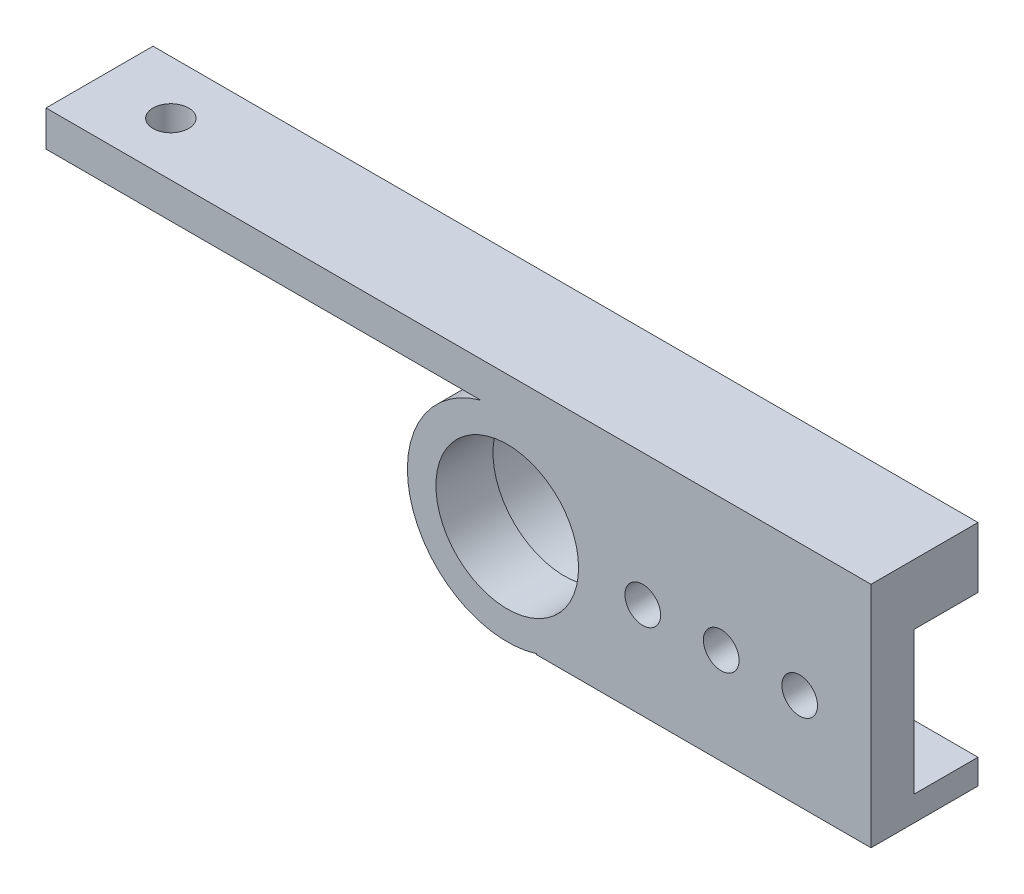
ISO-10303-21;
HEADER;
FILE_DESCRIPTION(('STEP AP214'),'2;1');
FILE_NAME('part.step','',(''),(''),'','','');
FILE_SCHEMA(('AUTOMOTIVE_DESIGN { 1 0 10303 214 1 1 1 1 }'));
ENDSEC;
DATA;
#1=APPLICATION_CONTEXT('core data for automotive mechanical design processes');
#2=APPLICATION_PROTOCOL_DEFINITION('international standard','automotive_design',2000,#1);
#3=PRODUCT_CONTEXT('',#1,'mechanical');
#4=PRODUCT('Part','Part','',(#3));
#5=PRODUCT_RELATED_PRODUCT_CATEGORY('part','',(#4));
#6=PRODUCT_DEFINITION_FORMATION('','',#4);
#7=PRODUCT_DEFINITION_CONTEXT('part definition',#1,'design');
#8=PRODUCT_DEFINITION('design','',#6,#7);
#9=PRODUCT_DEFINITION_SHAPE('','',#8);
#10=(LENGTH_UNIT() NAMED_UNIT(*) SI_UNIT(.MILLI.,.METRE.));
#11=(NAMED_UNIT(*) PLANE_ANGLE_UNIT() SI_UNIT($,.RADIAN.));
#12=(NAMED_UNIT(*) SI_UNIT($,.STERADIAN.) SOLID_ANGLE_UNIT());
#13=UNCERTAINTY_MEASURE_WITH_UNIT(LENGTH_MEASURE(1.E-05),#10,'distance_accuracy_value','');
#14=(GEOMETRIC_REPRESENTATION_CONTEXT(3) GLOBAL_UNCERTAINTY_ASSIGNED_CONTEXT((#13)) GLOBAL_UNIT_ASSIGNED_CONTEXT((#10,
#11,#12)) REPRESENTATION_CONTEXT('',''));
#15=CARTESIAN_POINT('',(0.,0.,0.));
#16=DIRECTION('',(0.,0.,1.));
#17=DIRECTION('',(1.,0.,0.));
#18=AXIS2_PLACEMENT_3D('',#15,#16,#17);
#19=CARTESIAN_POINT('',(-31.,0.,-9.));
#20=DIRECTION('',(0.,0.,1.));
#21=DIRECTION('',(1.,0.,0.));
#22=AXIS2_PLACEMENT_3D('',#19,#20,#21);
#23=CYLINDRICAL_SURFACE('',#22,11.);
#24=CARTESIAN_POINT('',(-31.,0.,-9.));
#25=DIRECTION('',(0.,0.,1.));
#26=DIRECTION('',(1.,0.,0.));
#27=AXIS2_PLACEMENT_3D('',#24,#25,#26);
#28=CIRCLE('',#27,11.);
#29=CARTESIAN_POINT('',(-20.,0.,-9.));
#30=VERTEX_POINT('',#29);
#31=EDGE_CURVE('E177',#30,#30,#28,.T.);
#32=ORIENTED_EDGE('',*,*,#31,.F.);
#33=EDGE_LOOP('',(#32));
#34=FACE_BOUND('',#33,.T.);
#35=CARTESIAN_POINT('',(-31.,0.,-2.));
#36=DIRECTION('',(0.,0.,1.));
#37=DIRECTION('',(1.,0.,0.));
#38=AXIS2_PLACEMENT_3D('',#35,#36,#37);
#39=CIRCLE('',#38,11.);
#40=CARTESIAN_POINT('',(-20.,0.,-2.));
#41=VERTEX_POINT('',#40);
#42=EDGE_CURVE('E11',#41,#41,#39,.F.);
#43=ORIENTED_EDGE('',*,*,#42,.F.);
#44=EDGE_LOOP('',(#43));
#45=FACE_BOUND('',#44,.T.);
#46=ADVANCED_FACE('F44',(#34,#45),#23,.F.);
#47=CARTESIAN_POINT('',(20.,-10.,6.));
#48=DIRECTION('',(-1.,0.,0.));
#49=DIRECTION('',(0.,0.,1.));
#50=AXIS2_PLACEMENT_3D('',#47,#48,#49);
#51=PLANE('',#50);
#52=DIRECTION('',(0.,1.,0.));
#53=VECTOR('',#52,1.);
#54=CARTESIAN_POINT('',(20.,-10.,0.));
#55=LINE('',#54,#53);
#56=CARTESIAN_POINT('',(20.,-10.,0.));
#57=VERTEX_POINT('',#56);
#58=CARTESIAN_POINT('',(20.,10.,0.));
#59=VERTEX_POINT('',#58);
#60=EDGE_CURVE('E270',#57,#59,#55,.T.);
#61=ORIENTED_EDGE('',*,*,#60,.T.);
#62=DIRECTION('',(0.,0.,1.));
#63=VECTOR('',#62,1.);
#64=CARTESIAN_POINT('',(20.,10.,-9.));
#65=LINE('',#64,#63);
#66=CARTESIAN_POINT('',(20.,10.,-9.));
#67=VERTEX_POINT('',#66);
#68=EDGE_CURVE('E234',#67,#59,#65,.T.);
#69=ORIENTED_EDGE('',*,*,#68,.F.);
#70=DIRECTION('',(0.,-1.,0.));
#71=VECTOR('',#70,1.);
#72=CARTESIAN_POINT('',(20.,0.,-9.));
#73=LINE('',#72,#71);
#74=CARTESIAN_POINT('',(20.,18.5,-9.));
#75=VERTEX_POINT('',#74);
#76=EDGE_CURVE('E189',#75,#67,#73,.T.);
#77=ORIENTED_EDGE('',*,*,#76,.F.);
#78=DIRECTION('',(0.,0.,1.));
#79=VECTOR('',#78,1.);
#80=CARTESIAN_POINT('',(20.,18.5,6.));
#81=LINE('',#80,#79);
#82=CARTESIAN_POINT('',(20.,18.5,6.));
#83=VERTEX_POINT('',#82);
#84=EDGE_CURVE('E154',#75,#83,#81,.T.);
#85=ORIENTED_EDGE('',*,*,#84,.T.);
#86=DIRECTION('',(0.,1.,0.));
#87=VECTOR('',#86,1.);
#88=CARTESIAN_POINT('',(20.,-10.,6.));
#89=LINE('',#88,#87);
#90=CARTESIAN_POINT('',(20.,-13.5,6.));
#91=VERTEX_POINT('',#90);
#92=EDGE_CURVE('E260',#91,#83,#89,.T.);
#93=ORIENTED_EDGE('',*,*,#92,.F.);
#94=DIRECTION('',(0.,0.,1.));
#95=VECTOR('',#94,1.);
#96=CARTESIAN_POINT('',(20.,-13.5,-9.));
#97=LINE('',#96,#95);
#98=CARTESIAN_POINT('',(20.,-13.5,-9.));
#99=VERTEX_POINT('',#98);
#100=EDGE_CURVE('E225',#99,#91,#97,.T.);
#101=ORIENTED_EDGE('',*,*,#100,.F.);
#102=DIRECTION('',(0.,-1.,0.));
#103=VECTOR('',#102,1.);
#104=CARTESIAN_POINT('',(20.,0.,-9.));
#105=LINE('',#104,#103);
#106=CARTESIAN_POINT('',(20.,-10.,-9.));
#107=VERTEX_POINT('',#106);
#108=EDGE_CURVE('E199',#107,#99,#105,.T.);
#109=ORIENTED_EDGE('',*,*,#108,.F.);
#110=DIRECTION('',(0.,0.,1.));
#111=VECTOR('',#110,1.);
#112=CARTESIAN_POINT('',(20.,-10.,-9.));
#113=LINE('',#112,#111);
#114=EDGE_CURVE('E222',#107,#57,#113,.T.);
#115=ORIENTED_EDGE('',*,*,#114,.T.);
#116=EDGE_LOOP('',(#61,#69,#77,#85,#93,#101,#109,#115));
#117=FACE_BOUND('',#116,.T.);
#118=ADVANCED_FACE('F46',(#117),#51,.F.);
#119=CARTESIAN_POINT('',(0.,0.,6.));
#120=DIRECTION('',(0.,0.,1.));
#121=DIRECTION('',(1.,0.,0.));
#122=AXIS2_PLACEMENT_3D('',#119,#120,#121);
#123=PLANE('',#122);
#124=DIRECTION('',(0.,1.,0.));
#125=VECTOR('',#124,1.);
#126=CARTESIAN_POINT('',(-95.6651871210378,-14.,6.));
#127=LINE('',#126,#125);
#128=CARTESIAN_POINT('',(-95.6651871210378,13.5,6.));
#129=VERTEX_POINT('',#128);
#130=CARTESIAN_POINT('',(-95.6651871210378,18.5,6.));
#131=VERTEX_POINT('',#130);
#132=EDGE_CURVE('E59',#129,#131,#127,.T.);
#133=ORIENTED_EDGE('',*,*,#132,.F.);
#134=DIRECTION('',(1.,0.,0.));
#135=VECTOR('',#134,1.);
#136=CARTESIAN_POINT('',(-180.,13.5,6.));
#137=LINE('',#136,#135);
#138=CARTESIAN_POINT('',(-34.7080992435478,13.5,6.));
#139=VERTEX_POINT('',#138);
#140=EDGE_CURVE('E164',#129,#139,#137,.T.);
#141=ORIENTED_EDGE('',*,*,#140,.T.);
#142=CARTESIAN_POINT('',(-31.,0.,6.));
#143=DIRECTION('',(0.,0.,1.));
#144=DIRECTION('',(1.,0.,0.));
#145=AXIS2_PLACEMENT_3D('',#142,#143,#144);
#146=CIRCLE('',#145,14.);
#147=CARTESIAN_POINT('',(-26.8939671408107,-13.3843376436512,6.));
#148=VERTEX_POINT('',#147);
#149=EDGE_CURVE('E174',#139,#148,#146,.T.);
#150=ORIENTED_EDGE('',*,*,#149,.T.);
#151=DIRECTION('',(0.,1.,0.));
#152=VECTOR('',#151,1.);
#153=CARTESIAN_POINT('',(-26.8939671408107,0.,6.));
#154=LINE('',#153,#152);
#155=CARTESIAN_POINT('',(-26.8939671408107,-13.5,6.));
#156=VERTEX_POINT('',#155);
#157=EDGE_CURVE('E210',#156,#148,#154,.T.);
#158=ORIENTED_EDGE('',*,*,#157,.F.);
#159=DIRECTION('',(-1.,0.,0.));
#160=VECTOR('',#159,1.);
#161=CARTESIAN_POINT('',(0.,-13.5,6.));
#162=LINE('',#161,#160);
#163=EDGE_CURVE('E181',#91,#156,#162,.T.);
#164=ORIENTED_EDGE('',*,*,#163,.F.);
#165=ORIENTED_EDGE('',*,*,#92,.T.);
#166=DIRECTION('',(1.,0.,0.));
#167=VECTOR('',#166,1.);
#168=CARTESIAN_POINT('',(-180.,18.5,6.));
#169=LINE('',#168,#167);
#170=EDGE_CURVE('E160',#131,#83,#169,.T.);
#171=ORIENTED_EDGE('',*,*,#170,.F.);
#172=EDGE_LOOP('',(#133,#141,#150,#158,#164,#165,#171));
#173=FACE_BOUND('',#172,.T.);
#174=CARTESIAN_POINT('',(10.,0.,6.));
#175=DIRECTION('',(0.,0.,1.));
#176=DIRECTION('',(1.,0.,0.));
#177=AXIS2_PLACEMENT_3D('',#174,#175,#176);
#178=CIRCLE('',#177,2.5);
#179=CARTESIAN_POINT('',(12.5,0.,6.));
#180=VERTEX_POINT('',#179);
#181=EDGE_CURVE('E246',#180,#180,#178,.T.);
#182=ORIENTED_EDGE('',*,*,#181,.F.);
#183=EDGE_LOOP('',(#182));
#184=FACE_BOUND('',#183,.T.);
#185=CARTESIAN_POINT('',(-0.999999999999999,0.,6.));
#186=DIRECTION('',(0.,0.,1.));
#187=DIRECTION('',(1.,0.,0.));
#188=AXIS2_PLACEMENT_3D('',#185,#186,#187);
#189=CIRCLE('',#188,2.5);
#190=CARTESIAN_POINT('',(1.5,0.,6.));
#191=VERTEX_POINT('',#190);
#192=EDGE_CURVE('E249',#191,#191,#189,.T.);
#193=ORIENTED_EDGE('',*,*,#192,.F.);
#194=EDGE_LOOP('',(#193));
#195=FACE_BOUND('',#194,.T.);
#196=CARTESIAN_POINT('',(-12.,-1.53625178909098E-13,6.));
#197=DIRECTION('',(0.,0.,1.));
#198=DIRECTION('',(1.,0.,0.));
#199=AXIS2_PLACEMENT_3D('',#196,#197,#198);
#200=CIRCLE('',#199,2.5);
#201=CARTESIAN_POINT('',(-9.5,-1.53625178909098E-13,6.));
#202=VERTEX_POINT('',#201);
#203=EDGE_CURVE('E255',#202,#202,#200,.T.);
#204=ORIENTED_EDGE('',*,*,#203,.F.);
#205=EDGE_LOOP('',(#204));
#206=FACE_BOUND('',#205,.T.);
#207=CARTESIAN_POINT('',(-31.,0.,6.));
#208=DIRECTION('',(0.,0.,1.));
#209=DIRECTION('',(1.,0.,0.));
#210=AXIS2_PLACEMENT_3D('',#207,#208,#209);
#211=CIRCLE('',#210,10.);
#212=CARTESIAN_POINT('',(-21.,0.,6.));
#213=VERTEX_POINT('',#212);
#214=EDGE_CURVE('E170',#213,#213,#211,.T.);
#215=ORIENTED_EDGE('',*,*,#214,.F.);
#216=EDGE_LOOP('',(#215));
#217=FACE_BOUND('',#216,.T.);
#218=ADVANCED_FACE('F308',(#173,#184,#195,#206,#217),#123,.T.);
#219=CARTESIAN_POINT('',(0.,0.,0.));
#220=DIRECTION('',(0.,0.,1.));
#221=DIRECTION('',(1.,0.,0.));
#222=AXIS2_PLACEMENT_3D('',#219,#220,#221);
#223=PLANE('',#222);
#224=CARTESIAN_POINT('',(10.,0.,0.));
#225=DIRECTION('',(0.,0.,1.));
#226=DIRECTION('',(1.,0.,0.));
#227=AXIS2_PLACEMENT_3D('',#224,#225,#226);
#228=CIRCLE('',#227,2.5);
#229=CARTESIAN_POINT('',(12.5,0.,0.));
#230=VERTEX_POINT('',#229);
#231=EDGE_CURVE('E242',#230,#230,#228,.T.);
#232=ORIENTED_EDGE('',*,*,#231,.T.);
#233=EDGE_LOOP('',(#232));
#234=FACE_BOUND('',#233,.T.);
#235=CARTESIAN_POINT('',(-0.999999999999999,0.,0.));
#236=DIRECTION('',(0.,0.,1.));
#237=DIRECTION('',(1.,0.,0.));
#238=AXIS2_PLACEMENT_3D('',#235,#236,#237);
#239=CIRCLE('',#238,2.5);
#240=CARTESIAN_POINT('',(1.5,0.,0.));
#241=VERTEX_POINT('',#240);
#242=EDGE_CURVE('E252',#241,#241,#239,.T.);
#243=ORIENTED_EDGE('',*,*,#242,.T.);
#244=EDGE_LOOP('',(#243));
#245=FACE_BOUND('',#244,.T.);
#246=CARTESIAN_POINT('',(-12.,-1.53625178909098E-13,0.));
#247=DIRECTION('',(0.,0.,1.));
#248=DIRECTION('',(1.,0.,0.));
#249=AXIS2_PLACEMENT_3D('',#246,#247,#248);
#250=CIRCLE('',#249,2.5);
#251=CARTESIAN_POINT('',(-9.5,-1.53625178909098E-13,0.));
#252=VERTEX_POINT('',#251);
#253=EDGE_CURVE('E218',#252,#252,#250,.T.);
#254=ORIENTED_EDGE('',*,*,#253,.T.);
#255=EDGE_LOOP('',(#254));
#256=FACE_BOUND('',#255,.T.);
#257=DIRECTION('',(0.,-1.,0.));
#258=VECTOR('',#257,1.);
#259=CARTESIAN_POINT('',(-20.,-10.,0.));
#260=LINE('',#259,#258);
#261=CARTESIAN_POINT('',(-20.,-8.66025403784439,0.));
#262=VERTEX_POINT('',#261);
#263=CARTESIAN_POINT('',(-20.,-10.,0.));
#264=VERTEX_POINT('',#263);
#265=EDGE_CURVE('E245',#262,#264,#260,.T.);
#266=ORIENTED_EDGE('',*,*,#265,.F.);
#267=CARTESIAN_POINT('',(-31.,0.,0.));
#268=DIRECTION('',(0.,0.,1.));
#269=DIRECTION('',(1.,0.,0.));
#270=AXIS2_PLACEMENT_3D('',#267,#268,#269);
#271=CIRCLE('',#270,14.);
#272=CARTESIAN_POINT('',(-20.,8.66025403784439,0.));
#273=VERTEX_POINT('',#272);
#274=EDGE_CURVE('E52',#262,#273,#271,.T.);
#275=ORIENTED_EDGE('',*,*,#274,.T.);
#276=CARTESIAN_POINT('',(-20.,10.,0.));
#277=VERTEX_POINT('',#276);
#278=EDGE_CURVE('E264',#277,#273,#260,.T.);
#279=ORIENTED_EDGE('',*,*,#278,.F.);
#280=DIRECTION('',(-1.,0.,0.));
#281=VECTOR('',#280,1.);
#282=CARTESIAN_POINT('',(20.,10.,0.));
#283=LINE('',#282,#281);
#284=EDGE_CURVE('E263',#59,#277,#283,.T.);
#285=ORIENTED_EDGE('',*,*,#284,.F.);
#286=ORIENTED_EDGE('',*,*,#60,.F.);
#287=DIRECTION('',(1.,0.,0.));
#288=VECTOR('',#287,1.);
#289=CARTESIAN_POINT('',(20.,-10.,0.));
#290=LINE('',#289,#288);
#291=EDGE_CURVE('E267',#264,#57,#290,.T.);
#292=ORIENTED_EDGE('',*,*,#291,.F.);
#293=EDGE_LOOP('',(#266,#275,#279,#285,#286,#292));
#294=FACE_BOUND('',#293,.T.);
#295=ADVANCED_FACE('F275',(#234,#245,#256,#294),#223,.F.);
#296=CARTESIAN_POINT('',(-12.,-1.53625178909098E-13,0.));
#297=DIRECTION('',(0.,0.,1.));
#298=DIRECTION('',(1.,0.,0.));
#299=AXIS2_PLACEMENT_3D('',#296,#297,#298);
#300=CYLINDRICAL_SURFACE('',#299,2.5);
#301=ORIENTED_EDGE('',*,*,#253,.F.);
#302=EDGE_LOOP('',(#301));
#303=FACE_BOUND('',#302,.T.);
#304=ORIENTED_EDGE('',*,*,#203,.T.);
#305=EDGE_LOOP('',(#304));
#306=FACE_BOUND('',#305,.T.);
#307=ADVANCED_FACE('F349',(#303,#306),#300,.F.);
#308=CARTESIAN_POINT('',(-0.999999999999999,0.,0.));
#309=DIRECTION('',(0.,0.,1.));
#310=DIRECTION('',(1.,0.,0.));
#311=AXIS2_PLACEMENT_3D('',#308,#309,#310);
#312=CYLINDRICAL_SURFACE('',#311,2.5);
#313=ORIENTED_EDGE('',*,*,#242,.F.);
#314=EDGE_LOOP('',(#313));
#315=FACE_BOUND('',#314,.T.);
#316=ORIENTED_EDGE('',*,*,#192,.T.);
#317=EDGE_LOOP('',(#316));
#318=FACE_BOUND('',#317,.T.);
#319=ADVANCED_FACE('F345',(#315,#318),#312,.F.);
#320=CARTESIAN_POINT('',(10.,0.,0.));
#321=DIRECTION('',(0.,0.,1.));
#322=DIRECTION('',(1.,0.,0.));
#323=AXIS2_PLACEMENT_3D('',#320,#321,#322);
#324=CYLINDRICAL_SURFACE('',#323,2.5);
#325=ORIENTED_EDGE('',*,*,#231,.F.);
#326=EDGE_LOOP('',(#325));
#327=FACE_BOUND('',#326,.T.);
#328=ORIENTED_EDGE('',*,*,#181,.T.);
#329=EDGE_LOOP('',(#328));
#330=FACE_BOUND('',#329,.T.);
#331=ADVANCED_FACE('F342',(#327,#330),#324,.F.);
#332=CARTESIAN_POINT('',(-31.,0.,-9.));
#333=DIRECTION('',(0.,0.,1.));
#334=DIRECTION('',(1.,0.,0.));
#335=AXIS2_PLACEMENT_3D('',#332,#333,#334);
#336=CYLINDRICAL_SURFACE('',#335,14.);
#337=ORIENTED_EDGE('',*,*,#274,.F.);
#338=DIRECTION('',(0.,0.,1.));
#339=VECTOR('',#338,1.);
#340=CARTESIAN_POINT('',(-20.,-8.66025403784439,-9.));
#341=LINE('',#340,#339);
#342=CARTESIAN_POINT('',(-20.,-8.66025403784439,-9.));
#343=VERTEX_POINT('',#342);
#344=EDGE_CURVE('E215',#343,#262,#341,.T.);
#345=ORIENTED_EDGE('',*,*,#344,.F.);
#346=CARTESIAN_POINT('',(-31.,0.,-9.));
#347=DIRECTION('',(0.,0.,1.));
#348=DIRECTION('',(1.,0.,0.));
#349=AXIS2_PLACEMENT_3D('',#346,#347,#348);
#350=CIRCLE('',#349,14.);
#351=CARTESIAN_POINT('',(-20.,8.66025403784439,-9.));
#352=VERTEX_POINT('',#351);
#353=EDGE_CURVE('E180',#343,#352,#350,.T.);
#354=ORIENTED_EDGE('',*,*,#353,.T.);
#355=DIRECTION('',(0.,0.,1.));
#356=VECTOR('',#355,1.);
#357=CARTESIAN_POINT('',(-20.,8.66025403784439,-9.));
#358=LINE('',#357,#356);
#359=EDGE_CURVE('E208',#352,#273,#358,.T.);
#360=ORIENTED_EDGE('',*,*,#359,.T.);
#361=EDGE_LOOP('',(#337,#345,#354,#360));
#362=FACE_BOUND('',#361,.T.);
#363=ADVANCED_FACE('F283',(#362),#336,.T.);
#364=CARTESIAN_POINT('',(-20.,0.,-9.));
#365=DIRECTION('',(-1.,0.,0.));
#366=DIRECTION('',(0.,0.,1.));
#367=AXIS2_PLACEMENT_3D('',#364,#365,#366);
#368=PLANE('',#367);
#369=ORIENTED_EDGE('',*,*,#344,.T.);
#370=ORIENTED_EDGE('',*,*,#265,.T.);
#371=DIRECTION('',(0.,0.,1.));
#372=VECTOR('',#371,1.);
#373=CARTESIAN_POINT('',(-20.,-10.,-9.));
#374=LINE('',#373,#372);
#375=CARTESIAN_POINT('',(-20.,-10.,-9.));
#376=VERTEX_POINT('',#375);
#377=EDGE_CURVE('E219',#376,#264,#374,.T.);
#378=ORIENTED_EDGE('',*,*,#377,.F.);
#379=DIRECTION('',(0.,-1.,0.));
#380=VECTOR('',#379,1.);
#381=CARTESIAN_POINT('',(-20.,0.,-9.));
#382=LINE('',#381,#380);
#383=EDGE_CURVE('E205',#343,#376,#382,.T.);
#384=ORIENTED_EDGE('',*,*,#383,.F.);
#385=EDGE_LOOP('',(#369,#370,#378,#384));
#386=FACE_BOUND('',#385,.T.);
#387=ADVANCED_FACE('F383',(#386),#368,.F.);
#388=CARTESIAN_POINT('',(0.,-10.,-9.));
#389=DIRECTION('',(0.,-1.,0.));
#390=DIRECTION('',(1.,0.,0.));
#391=AXIS2_PLACEMENT_3D('',#388,#389,#390);
#392=PLANE('',#391);
#393=ORIENTED_EDGE('',*,*,#377,.T.);
#394=ORIENTED_EDGE('',*,*,#291,.T.);
#395=ORIENTED_EDGE('',*,*,#114,.F.);
#396=DIRECTION('',(1.,0.,0.));
#397=VECTOR('',#396,1.);
#398=CARTESIAN_POINT('',(0.,-10.,-9.));
#399=LINE('',#398,#397);
#400=EDGE_CURVE('E202',#376,#107,#399,.T.);
#401=ORIENTED_EDGE('',*,*,#400,.F.);
#402=EDGE_LOOP('',(#393,#394,#395,#401));
#403=FACE_BOUND('',#402,.T.);
#404=ADVANCED_FACE('F293',(#403),#392,.F.);
#405=CARTESIAN_POINT('',(0.,10.,-9.));
#406=DIRECTION('',(0.,1.,0.));
#407=DIRECTION('',(-1.,0.,0.));
#408=AXIS2_PLACEMENT_3D('',#405,#406,#407);
#409=PLANE('',#408);
#410=ORIENTED_EDGE('',*,*,#68,.T.);
#411=ORIENTED_EDGE('',*,*,#284,.T.);
#412=DIRECTION('',(0.,0.,1.));
#413=VECTOR('',#412,1.);
#414=CARTESIAN_POINT('',(-20.,10.,-9.));
#415=LINE('',#414,#413);
#416=CARTESIAN_POINT('',(-20.,10.,-9.));
#417=VERTEX_POINT('',#416);
#418=EDGE_CURVE('E237',#417,#277,#415,.T.);
#419=ORIENTED_EDGE('',*,*,#418,.F.);
#420=DIRECTION('',(-1.,0.,0.));
#421=VECTOR('',#420,1.);
#422=CARTESIAN_POINT('',(0.,10.,-9.));
#423=LINE('',#422,#421);
#424=EDGE_CURVE('E186',#67,#417,#423,.T.);
#425=ORIENTED_EDGE('',*,*,#424,.F.);
#426=EDGE_LOOP('',(#410,#411,#419,#425));
#427=FACE_BOUND('',#426,.T.);
#428=ADVANCED_FACE('F289',(#427),#409,.F.);
#429=CARTESIAN_POINT('',(-20.,0.,-9.));
#430=DIRECTION('',(-1.,0.,0.));
#431=DIRECTION('',(0.,0.,1.));
#432=AXIS2_PLACEMENT_3D('',#429,#430,#431);
#433=PLANE('',#432);
#434=ORIENTED_EDGE('',*,*,#418,.T.);
#435=ORIENTED_EDGE('',*,*,#278,.T.);
#436=ORIENTED_EDGE('',*,*,#359,.F.);
#437=DIRECTION('',(0.,-1.,0.));
#438=VECTOR('',#437,1.);
#439=CARTESIAN_POINT('',(-20.,0.,-9.));
#440=LINE('',#439,#438);
#441=EDGE_CURVE('E184',#417,#352,#440,.T.);
#442=ORIENTED_EDGE('',*,*,#441,.F.);
#443=EDGE_LOOP('',(#434,#435,#436,#442));
#444=FACE_BOUND('',#443,.T.);
#445=ADVANCED_FACE('F281',(#444),#433,.F.);
#446=CARTESIAN_POINT('',(0.,-13.5,-9.));
#447=DIRECTION('',(0.,1.,0.));
#448=DIRECTION('',(0.,0.,1.));
#449=AXIS2_PLACEMENT_3D('',#446,#447,#448);
#450=PLANE('',#449);
#451=ORIENTED_EDGE('',*,*,#163,.T.);
#452=DIRECTION('',(0.,0.,1.));
#453=VECTOR('',#452,1.);
#454=CARTESIAN_POINT('',(-26.8939671408107,-13.5,-9.));
#455=LINE('',#454,#453);
#456=CARTESIAN_POINT('',(-26.8939671408107,-13.5,-9.));
#457=VERTEX_POINT('',#456);
#458=EDGE_CURVE('E228',#457,#156,#455,.T.);
#459=ORIENTED_EDGE('',*,*,#458,.F.);
#460=DIRECTION('',(-1.,0.,0.));
#461=VECTOR('',#460,1.);
#462=CARTESIAN_POINT('',(0.,-13.5,-9.));
#463=LINE('',#462,#461);
#464=EDGE_CURVE('E196',#99,#457,#463,.T.);
#465=ORIENTED_EDGE('',*,*,#464,.F.);
#466=ORIENTED_EDGE('',*,*,#100,.T.);
#467=EDGE_LOOP('',(#451,#459,#465,#466));
#468=FACE_BOUND('',#467,.T.);
#469=ADVANCED_FACE('F298',(#468),#450,.F.);
#470=CARTESIAN_POINT('',(-26.8939671408107,0.,-9.));
#471=DIRECTION('',(1.,0.,0.));
#472=DIRECTION('',(0.,0.,-1.));
#473=AXIS2_PLACEMENT_3D('',#470,#471,#472);
#474=PLANE('',#473);
#475=ORIENTED_EDGE('',*,*,#157,.T.);
#476=DIRECTION('',(0.,0.,1.));
#477=VECTOR('',#476,1.);
#478=CARTESIAN_POINT('',(-26.8939671408107,-13.3843376436512,-9.));
#479=LINE('',#478,#477);
#480=CARTESIAN_POINT('',(-26.8939671408107,-13.3843376436512,-9.));
#481=VERTEX_POINT('',#480);
#482=EDGE_CURVE('E231',#481,#148,#479,.T.);
#483=ORIENTED_EDGE('',*,*,#482,.F.);
#484=DIRECTION('',(0.,1.,0.));
#485=VECTOR('',#484,1.);
#486=CARTESIAN_POINT('',(-26.8939671408107,0.,-9.));
#487=LINE('',#486,#485);
#488=EDGE_CURVE('E193',#457,#481,#487,.T.);
#489=ORIENTED_EDGE('',*,*,#488,.F.);
#490=ORIENTED_EDGE('',*,*,#458,.T.);
#491=EDGE_LOOP('',(#475,#483,#489,#490));
#492=FACE_BOUND('',#491,.T.);
#493=ADVANCED_FACE('F301',(#492),#474,.F.);
#494=CARTESIAN_POINT('',(-31.,0.,-9.));
#495=DIRECTION('',(0.,0.,1.));
#496=DIRECTION('',(1.,0.,0.));
#497=AXIS2_PLACEMENT_3D('',#494,#495,#496);
#498=CYLINDRICAL_SURFACE('',#497,14.);
#499=DIRECTION('',(0.,0.,1.));
#500=VECTOR('',#499,1.);
#501=CARTESIAN_POINT('',(-34.7080992435478,13.5,-9.));
#502=LINE('',#501,#500);
#503=CARTESIAN_POINT('',(-34.7080992435478,13.5,-9.));
#504=VERTEX_POINT('',#503);
#505=EDGE_CURVE('E162',#504,#139,#502,.T.);
#506=ORIENTED_EDGE('',*,*,#505,.F.);
#507=CARTESIAN_POINT('',(-31.,0.,-9.));
#508=DIRECTION('',(0.,0.,1.));
#509=DIRECTION('',(1.,0.,0.));
#510=AXIS2_PLACEMENT_3D('',#507,#508,#509);
#511=CIRCLE('',#510,14.);
#512=EDGE_CURVE('E191',#504,#481,#511,.T.);
#513=ORIENTED_EDGE('',*,*,#512,.T.);
#514=ORIENTED_EDGE('',*,*,#482,.T.);
#515=ORIENTED_EDGE('',*,*,#149,.F.);
#516=EDGE_LOOP('',(#506,#513,#514,#515));
#517=FACE_BOUND('',#516,.T.);
#518=ADVANCED_FACE('F304',(#517),#498,.T.);
#519=CARTESIAN_POINT('',(0.,0.,-9.));
#520=DIRECTION('',(0.,0.,1.));
#521=DIRECTION('',(1.,0.,0.));
#522=AXIS2_PLACEMENT_3D('',#519,#520,#521);
#523=PLANE('',#522);
#524=DIRECTION('',(1.,0.,0.));
#525=VECTOR('',#524,1.);
#526=CARTESIAN_POINT('',(-180.,13.5,-9.));
#527=LINE('',#526,#525);
#528=CARTESIAN_POINT('',(-95.6651871210378,13.5,-9.));
#529=VERTEX_POINT('',#528);
#530=EDGE_CURVE('E67',#529,#504,#527,.T.);
#531=ORIENTED_EDGE('',*,*,#530,.F.);
#532=DIRECTION('',(0.,1.,0.));
#533=VECTOR('',#532,1.);
#534=CARTESIAN_POINT('',(-95.6651871210378,0.,-9.));
#535=LINE('',#534,#533);
#536=CARTESIAN_POINT('',(-95.6651871210378,18.5,-9.));
#537=VERTEX_POINT('',#536);
#538=EDGE_CURVE('E141',#529,#537,#535,.T.);
#539=ORIENTED_EDGE('',*,*,#538,.T.);
#540=DIRECTION('',(1.,0.,0.));
#541=VECTOR('',#540,1.);
#542=CARTESIAN_POINT('',(-180.,18.5,-9.));
#543=LINE('',#542,#541);
#544=EDGE_CURVE('E151',#537,#75,#543,.T.);
#545=ORIENTED_EDGE('',*,*,#544,.T.);
#546=ORIENTED_EDGE('',*,*,#76,.T.);
#547=ORIENTED_EDGE('',*,*,#424,.T.);
#548=ORIENTED_EDGE('',*,*,#441,.T.);
#549=ORIENTED_EDGE('',*,*,#353,.F.);
#550=ORIENTED_EDGE('',*,*,#383,.T.);
#551=ORIENTED_EDGE('',*,*,#400,.T.);
#552=ORIENTED_EDGE('',*,*,#108,.T.);
#553=ORIENTED_EDGE('',*,*,#464,.T.);
#554=ORIENTED_EDGE('',*,*,#488,.T.);
#555=ORIENTED_EDGE('',*,*,#512,.F.);
#556=EDGE_LOOP('',(#531,#539,#545,#546,#547,#548,#549,#550,#551,#552,#553,#554,#555));
#557=FACE_BOUND('',#556,.T.);
#558=ORIENTED_EDGE('',*,*,#31,.T.);
#559=EDGE_LOOP('',(#558));
#560=FACE_BOUND('',#559,.T.);
#561=ADVANCED_FACE('F148',(#557,#560),#523,.F.);
#562=CARTESIAN_POINT('',(-31.,0.,-2.));
#563=DIRECTION('',(0.,0.,1.));
#564=DIRECTION('',(1.,0.,0.));
#565=AXIS2_PLACEMENT_3D('',#562,#563,#564);
#566=PLANE('',#565);
#567=CARTESIAN_POINT('',(-31.,0.,-2.));
#568=DIRECTION('',(0.,0.,1.));
#569=DIRECTION('',(1.,0.,0.));
#570=AXIS2_PLACEMENT_3D('',#567,#568,#569);
#571=CIRCLE('',#570,10.);
#572=CARTESIAN_POINT('',(-21.,0.,-2.));
#573=VERTEX_POINT('',#572);
#574=EDGE_CURVE('E171',#573,#573,#571,.T.);
#575=ORIENTED_EDGE('',*,*,#574,.T.);
#576=EDGE_LOOP('',(#575));
#577=FACE_BOUND('',#576,.T.);
#578=ORIENTED_EDGE('',*,*,#42,.T.);
#579=EDGE_LOOP('',(#578));
#580=FACE_BOUND('',#579,.T.);
#581=ADVANCED_FACE('F371',(#577,#580),#566,.F.);
#582=CARTESIAN_POINT('',(-31.,0.,-2.));
#583=DIRECTION('',(0.,0.,1.));
#584=DIRECTION('',(1.,0.,0.));
#585=AXIS2_PLACEMENT_3D('',#582,#583,#584);
#586=CYLINDRICAL_SURFACE('',#585,10.);
#587=ORIENTED_EDGE('',*,*,#574,.F.);
#588=EDGE_LOOP('',(#587));
#589=FACE_BOUND('',#588,.T.);
#590=ORIENTED_EDGE('',*,*,#214,.T.);
#591=EDGE_LOOP('',(#590));
#592=FACE_BOUND('',#591,.T.);
#593=ADVANCED_FACE('F328',(#589,#592),#586,.F.);
#594=CARTESIAN_POINT('',(-180.,13.5,6.));
#595=DIRECTION('',(0.,-1.,0.));
#596=DIRECTION('',(0.,0.,-1.));
#597=AXIS2_PLACEMENT_3D('',#594,#595,#596);
#598=PLANE('',#597);
#599=CARTESIAN_POINT('',(-85.6651871210378,13.5,-1.5));
#600=DIRECTION('',(0.,-1.,0.));
#601=DIRECTION('',(0.,0.,-1.));
#602=AXIS2_PLACEMENT_3D('',#599,#600,#601);
#603=CIRCLE('',#602,2.49999999999999);
#604=CARTESIAN_POINT('',(-85.6651871210378,13.5,-3.99999999999999));
#605=VERTEX_POINT('',#604);
#606=EDGE_CURVE('E145',#605,#605,#603,.T.);
#607=ORIENTED_EDGE('',*,*,#606,.F.);
#608=EDGE_LOOP('',(#607));
#609=FACE_BOUND('',#608,.T.);
#610=DIRECTION('',(0.,0.,1.));
#611=VECTOR('',#610,1.);
#612=CARTESIAN_POINT('',(-95.6651871210378,13.5,6.));
#613=LINE('',#612,#611);
#614=EDGE_CURVE('E155',#529,#129,#613,.T.);
#615=ORIENTED_EDGE('',*,*,#614,.F.);
#616=ORIENTED_EDGE('',*,*,#530,.T.);
#617=ORIENTED_EDGE('',*,*,#505,.T.);
#618=ORIENTED_EDGE('',*,*,#140,.F.);
#619=EDGE_LOOP('',(#615,#616,#617,#618));
#620=FACE_BOUND('',#619,.T.);
#621=ADVANCED_FACE('F306',(#609,#620),#598,.T.);
#622=CARTESIAN_POINT('',(-180.,18.5,6.));
#623=DIRECTION('',(0.,1.,0.));
#624=DIRECTION('',(0.,0.,1.));
#625=AXIS2_PLACEMENT_3D('',#622,#623,#624);
#626=PLANE('',#625);
#627=CARTESIAN_POINT('',(-85.6651871210378,18.5,-1.5));
#628=DIRECTION('',(0.,1.,0.));
#629=DIRECTION('',(0.,0.,1.));
#630=AXIS2_PLACEMENT_3D('',#627,#628,#629);
#631=CIRCLE('',#630,2.49999999999999);
#632=CARTESIAN_POINT('',(-85.6651871210378,18.5,0.999999999999995));
#633=VERTEX_POINT('',#632);
#634=EDGE_CURVE('E315',#633,#633,#631,.T.);
#635=ORIENTED_EDGE('',*,*,#634,.F.);
#636=EDGE_LOOP('',(#635));
#637=FACE_BOUND('',#636,.T.);
#638=DIRECTION('',(0.,0.,-1.));
#639=VECTOR('',#638,1.);
#640=CARTESIAN_POINT('',(-95.6651871210378,18.5,6.));
#641=LINE('',#640,#639);
#642=EDGE_CURVE('E138',#131,#537,#641,.T.);
#643=ORIENTED_EDGE('',*,*,#642,.F.);
#644=ORIENTED_EDGE('',*,*,#170,.T.);
#645=ORIENTED_EDGE('',*,*,#84,.F.);
#646=ORIENTED_EDGE('',*,*,#544,.F.);
#647=EDGE_LOOP('',(#643,#644,#645,#646));
#648=FACE_BOUND('',#647,.T.);
#649=ADVANCED_FACE('F158',(#637,#648),#626,.T.);
#650=CARTESIAN_POINT('',(-95.6651871210378,-14.,6.));
#651=DIRECTION('',(1.,0.,0.));
#652=DIRECTION('',(0.,0.,-1.));
#653=AXIS2_PLACEMENT_3D('',#650,#651,#652);
#654=PLANE('',#653);
#655=ORIENTED_EDGE('',*,*,#614,.T.);
#656=ORIENTED_EDGE('',*,*,#132,.T.);
#657=ORIENTED_EDGE('',*,*,#642,.T.);
#658=ORIENTED_EDGE('',*,*,#538,.F.);
#659=EDGE_LOOP('',(#655,#656,#657,#658));
#660=FACE_BOUND('',#659,.T.);
#661=ADVANCED_FACE('F140',(#660),#654,.F.);
#662=CARTESIAN_POINT('',(-85.6651871210378,8.5,-1.5));
#663=DIRECTION('',(0.,1.,0.));
#664=DIRECTION('',(0.,0.,1.));
#665=AXIS2_PLACEMENT_3D('',#662,#663,#664);
#666=CYLINDRICAL_SURFACE('',#665,2.49999999999999);
#667=ORIENTED_EDGE('',*,*,#606,.T.);
#668=EDGE_LOOP('',(#667));
#669=FACE_BOUND('',#668,.T.);
#670=ORIENTED_EDGE('',*,*,#634,.T.);
#671=EDGE_LOOP('',(#670));
#672=FACE_BOUND('',#671,.T.);
#673=ADVANCED_FACE('F319',(#669,#672),#666,.F.);
#674=CLOSED_SHELL('',(#46,#118,#218,#295,#307,#319,#331,#363,#387,#404,#428,#445,#469,#493,#518,
#561,#581,#593,#621,#649,#661,#673));
#675=MANIFOLD_SOLID_BREP('B2',#674);
#676=ADVANCED_BREP_SHAPE_REPRESENTATION('',(#18,#675),#14);
#677=SHAPE_DEFINITION_REPRESENTATION(#9,#676);
ENDSEC;
END-ISO-10303-21;
